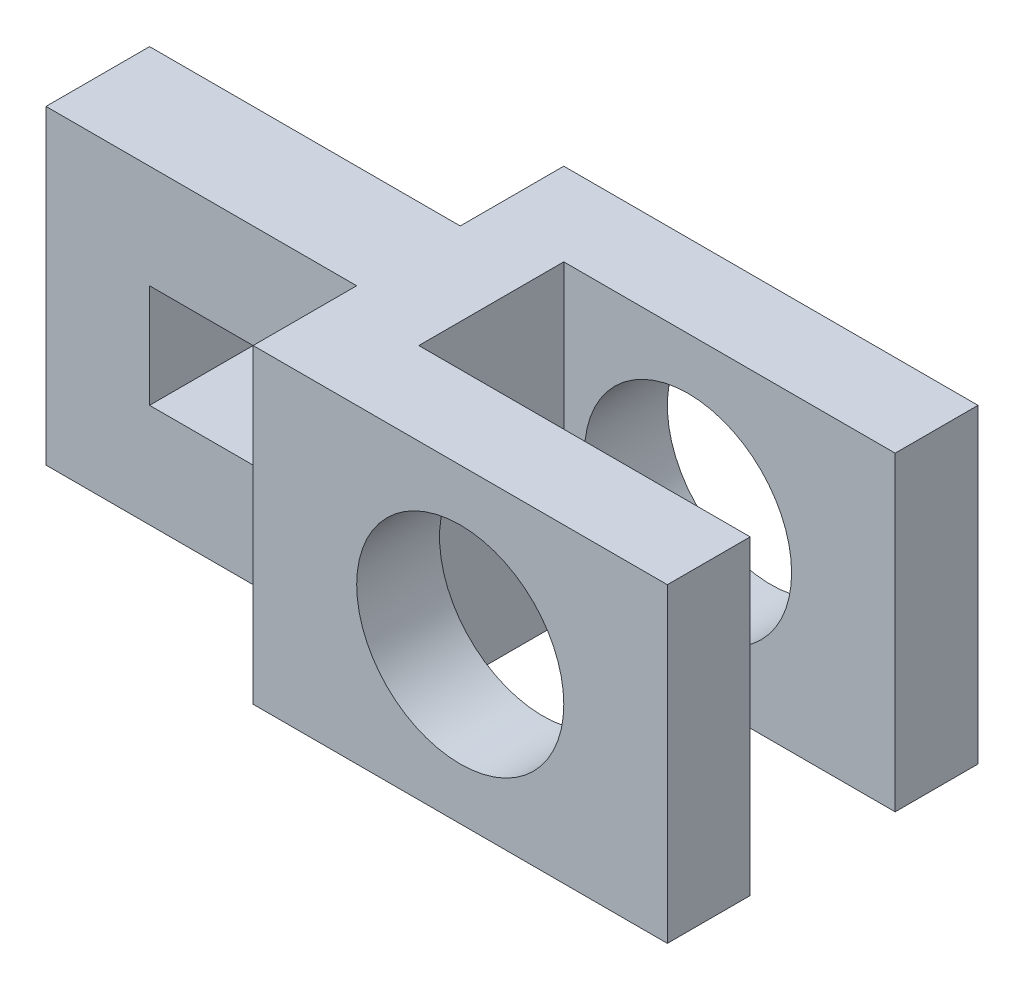
ISO-10303-21;
HEADER;
FILE_DESCRIPTION(('STEP AP214'),'2;1');
FILE_NAME('part.step','',(''),(''),'','','');
FILE_SCHEMA(('AUTOMOTIVE_DESIGN { 1 0 10303 214 1 1 1 1 }'));
ENDSEC;
DATA;
#1=APPLICATION_CONTEXT('core data for automotive mechanical design processes');
#2=APPLICATION_PROTOCOL_DEFINITION('international standard','automotive_design',2000,#1);
#3=PRODUCT_CONTEXT('',#1,'mechanical');
#4=PRODUCT('Part','Part','',(#3));
#5=PRODUCT_RELATED_PRODUCT_CATEGORY('part','',(#4));
#6=PRODUCT_DEFINITION_FORMATION('','',#4);
#7=PRODUCT_DEFINITION_CONTEXT('part definition',#1,'design');
#8=PRODUCT_DEFINITION('design','',#6,#7);
#9=PRODUCT_DEFINITION_SHAPE('','',#8);
#10=(LENGTH_UNIT() NAMED_UNIT(*) SI_UNIT(.MILLI.,.METRE.));
#11=(NAMED_UNIT(*) PLANE_ANGLE_UNIT() SI_UNIT($,.RADIAN.));
#12=(NAMED_UNIT(*) SI_UNIT($,.STERADIAN.) SOLID_ANGLE_UNIT());
#13=UNCERTAINTY_MEASURE_WITH_UNIT(LENGTH_MEASURE(1.E-05),#10,'distance_accuracy_value','');
#14=(GEOMETRIC_REPRESENTATION_CONTEXT(3) GLOBAL_UNCERTAINTY_ASSIGNED_CONTEXT((#13)) GLOBAL_UNIT_ASSIGNED_CONTEXT((#10,
#11,#12)) REPRESENTATION_CONTEXT('',''));
#15=CARTESIAN_POINT('',(0.,0.,0.));
#16=DIRECTION('',(0.,0.,1.));
#17=DIRECTION('',(1.,0.,0.));
#18=AXIS2_PLACEMENT_3D('',#15,#16,#17);
#19=CARTESIAN_POINT('',(-60.496316141996,30.,-13.866104181659));
#20=DIRECTION('',(1.,0.,0.));
#21=DIRECTION('',(0.,0.,-1.));
#22=AXIS2_PLACEMENT_3D('',#19,#20,#21);
#23=PLANE('',#22);
#24=DIRECTION('',(0.,0.,1.));
#25=VECTOR('',#24,1.);
#26=CARTESIAN_POINT('',(-60.496316141996,0.,-13.866104181659));
#27=LINE('',#26,#25);
#28=CARTESIAN_POINT('',(-60.496316141996,0.,-23.8677160080375));
#29=VERTEX_POINT('',#28);
#30=CARTESIAN_POINT('',(-60.496316141996,0.,-13.866104181659));
#31=VERTEX_POINT('',#30);
#32=EDGE_CURVE('E185',#29,#31,#27,.T.);
#33=ORIENTED_EDGE('',*,*,#32,.T.);
#34=DIRECTION('',(0.,-1.,0.));
#35=VECTOR('',#34,1.);
#36=CARTESIAN_POINT('',(-60.496316141996,30.,-13.866104181659));
#37=LINE('',#36,#35);
#38=CARTESIAN_POINT('',(-60.496316141996,30.,-13.866104181659));
#39=VERTEX_POINT('',#38);
#40=EDGE_CURVE('E268',#39,#31,#37,.T.);
#41=ORIENTED_EDGE('',*,*,#40,.F.);
#42=DIRECTION('',(0.,0.,1.));
#43=VECTOR('',#42,1.);
#44=CARTESIAN_POINT('',(-60.496316141996,30.,-13.866104181659));
#45=LINE('',#44,#43);
#46=CARTESIAN_POINT('',(-60.496316141996,30.,-23.8677160080375));
#47=VERTEX_POINT('',#46);
#48=EDGE_CURVE('E186',#47,#39,#45,.T.);
#49=ORIENTED_EDGE('',*,*,#48,.F.);
#50=DIRECTION('',(0.,-1.,0.));
#51=VECTOR('',#50,1.);
#52=CARTESIAN_POINT('',(-60.496316141996,30.,-23.8677160080375));
#53=LINE('',#52,#51);
#54=EDGE_CURVE('E212',#47,#29,#53,.T.);
#55=ORIENTED_EDGE('',*,*,#54,.T.);
#56=EDGE_LOOP('',(#33,#41,#49,#55));
#57=FACE_BOUND('',#56,.T.);
#58=ADVANCED_FACE('F33',(#57),#23,.F.);
#59=CARTESIAN_POINT('',(-30.496316141996,30.,-13.866104181659));
#60=DIRECTION('',(0.,0.,-1.));
#61=DIRECTION('',(-1.,0.,0.));
#62=AXIS2_PLACEMENT_3D('',#59,#60,#61);
#63=PLANE('',#62);
#64=DIRECTION('',(-1.,0.,0.));
#65=VECTOR('',#64,1.);
#66=CARTESIAN_POINT('',(-40.496316141996,20.,-13.866104181659));
#67=LINE('',#66,#65);
#68=CARTESIAN_POINT('',(-40.496316141996,20.,-13.866104181659));
#69=VERTEX_POINT('',#68);
#70=CARTESIAN_POINT('',(-50.496316141996,20.,-13.866104181659));
#71=VERTEX_POINT('',#70);
#72=EDGE_CURVE('E157',#69,#71,#67,.T.);
#73=ORIENTED_EDGE('',*,*,#72,.F.);
#74=DIRECTION('',(0.,1.,0.));
#75=VECTOR('',#74,1.);
#76=CARTESIAN_POINT('',(-40.496316141996,20.,-13.866104181659));
#77=LINE('',#76,#75);
#78=CARTESIAN_POINT('',(-40.496316141996,9.99999999999999,-13.866104181659));
#79=VERTEX_POINT('',#78);
#80=EDGE_CURVE('E47',#79,#69,#77,.T.);
#81=ORIENTED_EDGE('',*,*,#80,.F.);
#82=DIRECTION('',(1.,0.,0.));
#83=VECTOR('',#82,1.);
#84=CARTESIAN_POINT('',(-40.496316141996,9.99999999999999,-13.866104181659));
#85=LINE('',#84,#83);
#86=CARTESIAN_POINT('',(-50.496316141996,9.99999999999999,-13.866104181659));
#87=VERTEX_POINT('',#86);
#88=EDGE_CURVE('E164',#87,#79,#85,.T.);
#89=ORIENTED_EDGE('',*,*,#88,.F.);
#90=DIRECTION('',(0.,-1.,0.));
#91=VECTOR('',#90,1.);
#92=CARTESIAN_POINT('',(-50.496316141996,20.,-13.866104181659));
#93=LINE('',#92,#91);
#94=EDGE_CURVE('E148',#71,#87,#93,.T.);
#95=ORIENTED_EDGE('',*,*,#94,.F.);
#96=EDGE_LOOP('',(#73,#81,#89,#95));
#97=FACE_BOUND('',#96,.T.);
#98=DIRECTION('',(1.,0.,0.));
#99=VECTOR('',#98,1.);
#100=CARTESIAN_POINT('',(-30.496316141996,0.,-13.866104181659));
#101=LINE('',#100,#99);
#102=CARTESIAN_POINT('',(-30.496316141996,0.,-13.866104181659));
#103=VERTEX_POINT('',#102);
#104=EDGE_CURVE('E215',#31,#103,#101,.T.);
#105=ORIENTED_EDGE('',*,*,#104,.T.);
#106=DIRECTION('',(0.,-1.,0.));
#107=VECTOR('',#106,1.);
#108=CARTESIAN_POINT('',(-30.496316141996,30.,-13.866104181659));
#109=LINE('',#108,#107);
#110=CARTESIAN_POINT('',(-30.496316141996,30.,-13.866104181659));
#111=VERTEX_POINT('',#110);
#112=EDGE_CURVE('E265',#111,#103,#109,.T.);
#113=ORIENTED_EDGE('',*,*,#112,.F.);
#114=DIRECTION('',(1.,0.,0.));
#115=VECTOR('',#114,1.);
#116=CARTESIAN_POINT('',(-30.496316141996,30.,-13.866104181659));
#117=LINE('',#116,#115);
#118=EDGE_CURVE('E189',#39,#111,#117,.T.);
#119=ORIENTED_EDGE('',*,*,#118,.F.);
#120=ORIENTED_EDGE('',*,*,#40,.T.);
#121=EDGE_LOOP('',(#105,#113,#119,#120));
#122=FACE_BOUND('',#121,.T.);
#123=ADVANCED_FACE('F161',(#97,#122),#63,.F.);
#124=CARTESIAN_POINT('',(-30.496316141996,30.,-3.86771600803751));
#125=DIRECTION('',(1.,0.,0.));
#126=DIRECTION('',(0.,0.,-1.));
#127=AXIS2_PLACEMENT_3D('',#124,#125,#126);
#128=PLANE('',#127);
#129=DIRECTION('',(0.,0.,1.));
#130=VECTOR('',#129,1.);
#131=CARTESIAN_POINT('',(-30.496316141996,0.,-3.86771600803751));
#132=LINE('',#131,#130);
#133=CARTESIAN_POINT('',(-30.496316141996,0.,-3.86771600803751));
#134=VERTEX_POINT('',#133);
#135=EDGE_CURVE('E217',#103,#134,#132,.T.);
#136=ORIENTED_EDGE('',*,*,#135,.T.);
#137=DIRECTION('',(0.,-1.,0.));
#138=VECTOR('',#137,1.);
#139=CARTESIAN_POINT('',(-30.496316141996,30.,-3.86771600803751));
#140=LINE('',#139,#138);
#141=CARTESIAN_POINT('',(-30.496316141996,30.,-3.86771600803751));
#142=VERTEX_POINT('',#141);
#143=EDGE_CURVE('E262',#142,#134,#140,.T.);
#144=ORIENTED_EDGE('',*,*,#143,.F.);
#145=DIRECTION('',(0.,0.,1.));
#146=VECTOR('',#145,1.);
#147=CARTESIAN_POINT('',(-30.496316141996,30.,-3.86771600803751));
#148=LINE('',#147,#146);
#149=EDGE_CURVE('E192',#111,#142,#148,.T.);
#150=ORIENTED_EDGE('',*,*,#149,.F.);
#151=ORIENTED_EDGE('',*,*,#112,.T.);
#152=EDGE_LOOP('',(#136,#144,#150,#151));
#153=FACE_BOUND('',#152,.T.);
#154=ADVANCED_FACE('F298',(#153),#128,.F.);
#155=CARTESIAN_POINT('',(-30.496316141996,30.,-3.86771600803751));
#156=DIRECTION('',(0.,0.,-1.));
#157=DIRECTION('',(-1.,0.,0.));
#158=AXIS2_PLACEMENT_3D('',#155,#156,#157);
#159=PLANE('',#158);
#160=CARTESIAN_POINT('',(-10.496316141996,15.,-3.86771600803751));
#161=DIRECTION('',(0.,0.,-1.));
#162=DIRECTION('',(-1.,0.,0.));
#163=AXIS2_PLACEMENT_3D('',#160,#161,#162);
#164=CIRCLE('',#163,10.);
#165=CARTESIAN_POINT('',(-20.496316141996,15.,-3.86771600803751));
#166=VERTEX_POINT('',#165);
#167=EDGE_CURVE('E182',#166,#166,#164,.T.);
#168=ORIENTED_EDGE('',*,*,#167,.T.);
#169=EDGE_LOOP('',(#168));
#170=FACE_BOUND('',#169,.T.);
#171=DIRECTION('',(1.,0.,0.));
#172=VECTOR('',#171,1.);
#173=CARTESIAN_POINT('',(-30.496316141996,0.,-3.86771600803751));
#174=LINE('',#173,#172);
#175=CARTESIAN_POINT('',(9.50368385800401,0.,-3.86771600803751));
#176=VERTEX_POINT('',#175);
#177=EDGE_CURVE('E219',#134,#176,#174,.T.);
#178=ORIENTED_EDGE('',*,*,#177,.T.);
#179=DIRECTION('',(0.,-1.,0.));
#180=VECTOR('',#179,1.);
#181=CARTESIAN_POINT('',(9.50368385800401,30.,-3.86771600803751));
#182=LINE('',#181,#180);
#183=CARTESIAN_POINT('',(9.50368385800401,30.,-3.86771600803751));
#184=VERTEX_POINT('',#183);
#185=EDGE_CURVE('E259',#184,#176,#182,.T.);
#186=ORIENTED_EDGE('',*,*,#185,.F.);
#187=DIRECTION('',(1.,0.,0.));
#188=VECTOR('',#187,1.);
#189=CARTESIAN_POINT('',(-30.496316141996,30.,-3.86771600803751));
#190=LINE('',#189,#188);
#191=EDGE_CURVE('E194',#142,#184,#190,.T.);
#192=ORIENTED_EDGE('',*,*,#191,.F.);
#193=ORIENTED_EDGE('',*,*,#143,.T.);
#194=EDGE_LOOP('',(#178,#186,#192,#193));
#195=FACE_BOUND('',#194,.T.);
#196=ADVANCED_FACE('F350',(#170,#195),#159,.F.);
#197=CARTESIAN_POINT('',(9.50368385800401,30.,-3.86771600803751));
#198=DIRECTION('',(-1.,0.,0.));
#199=DIRECTION('',(0.,0.,1.));
#200=AXIS2_PLACEMENT_3D('',#197,#198,#199);
#201=PLANE('',#200);
#202=DIRECTION('',(0.,0.,-1.));
#203=VECTOR('',#202,1.);
#204=CARTESIAN_POINT('',(9.50368385800401,0.,-3.86771600803751));
#205=LINE('',#204,#203);
#206=CARTESIAN_POINT('',(9.50368385800401,0.,-11.8677160080375));
#207=VERTEX_POINT('',#206);
#208=EDGE_CURVE('E221',#176,#207,#205,.T.);
#209=ORIENTED_EDGE('',*,*,#208,.T.);
#210=DIRECTION('',(0.,-1.,0.));
#211=VECTOR('',#210,1.);
#212=CARTESIAN_POINT('',(9.50368385800401,30.,-11.8677160080375));
#213=LINE('',#212,#211);
#214=CARTESIAN_POINT('',(9.50368385800401,30.,-11.8677160080375));
#215=VERTEX_POINT('',#214);
#216=EDGE_CURVE('E256',#215,#207,#213,.T.);
#217=ORIENTED_EDGE('',*,*,#216,.F.);
#218=DIRECTION('',(0.,0.,-1.));
#219=VECTOR('',#218,1.);
#220=CARTESIAN_POINT('',(9.50368385800401,30.,-3.86771600803751));
#221=LINE('',#220,#219);
#222=EDGE_CURVE('E196',#184,#215,#221,.T.);
#223=ORIENTED_EDGE('',*,*,#222,.F.);
#224=ORIENTED_EDGE('',*,*,#185,.T.);
#225=EDGE_LOOP('',(#209,#217,#223,#224));
#226=FACE_BOUND('',#225,.T.);
#227=ADVANCED_FACE('F347',(#226),#201,.F.);
#228=CARTESIAN_POINT('',(9.50368385800401,30.,-11.8677160080375));
#229=DIRECTION('',(0.,0.,1.));
#230=DIRECTION('',(1.,0.,0.));
#231=AXIS2_PLACEMENT_3D('',#228,#229,#230);
#232=PLANE('',#231);
#233=CARTESIAN_POINT('',(-10.496316141996,15.,-11.8677160080375));
#234=DIRECTION('',(0.,0.,1.));
#235=DIRECTION('',(1.,0.,0.));
#236=AXIS2_PLACEMENT_3D('',#233,#234,#235);
#237=CIRCLE('',#236,10.);
#238=CARTESIAN_POINT('',(-0.49631614199599,15.,-11.8677160080375));
#239=VERTEX_POINT('',#238);
#240=EDGE_CURVE('E179',#239,#239,#237,.T.);
#241=ORIENTED_EDGE('',*,*,#240,.T.);
#242=EDGE_LOOP('',(#241));
#243=FACE_BOUND('',#242,.T.);
#244=DIRECTION('',(-1.,0.,0.));
#245=VECTOR('',#244,1.);
#246=CARTESIAN_POINT('',(9.50368385800401,0.,-11.8677160080375));
#247=LINE('',#246,#245);
#248=CARTESIAN_POINT('',(-22.496316141996,0.,-11.8677160080375));
#249=VERTEX_POINT('',#248);
#250=EDGE_CURVE('E223',#207,#249,#247,.T.);
#251=ORIENTED_EDGE('',*,*,#250,.T.);
#252=DIRECTION('',(0.,-1.,0.));
#253=VECTOR('',#252,1.);
#254=CARTESIAN_POINT('',(-22.496316141996,30.,-11.8677160080375));
#255=LINE('',#254,#253);
#256=CARTESIAN_POINT('',(-22.496316141996,30.,-11.8677160080375));
#257=VERTEX_POINT('',#256);
#258=EDGE_CURVE('E253',#257,#249,#255,.T.);
#259=ORIENTED_EDGE('',*,*,#258,.F.);
#260=DIRECTION('',(-1.,0.,0.));
#261=VECTOR('',#260,1.);
#262=CARTESIAN_POINT('',(9.50368385800401,30.,-11.8677160080375));
#263=LINE('',#262,#261);
#264=EDGE_CURVE('E198',#215,#257,#263,.T.);
#265=ORIENTED_EDGE('',*,*,#264,.F.);
#266=ORIENTED_EDGE('',*,*,#216,.T.);
#267=EDGE_LOOP('',(#251,#259,#265,#266));
#268=FACE_BOUND('',#267,.T.);
#269=ADVANCED_FACE('F343',(#243,#268),#232,.F.);
#270=CARTESIAN_POINT('',(-22.496316141996,30.,-11.8677160080375));
#271=DIRECTION('',(-1.,0.,0.));
#272=DIRECTION('',(0.,0.,1.));
#273=AXIS2_PLACEMENT_3D('',#270,#271,#272);
#274=PLANE('',#273);
#275=DIRECTION('',(0.,0.,-1.));
#276=VECTOR('',#275,1.);
#277=CARTESIAN_POINT('',(-22.496316141996,0.,-11.8677160080375));
#278=LINE('',#277,#276);
#279=CARTESIAN_POINT('',(-22.496316141996,0.,-25.8677160080375));
#280=VERTEX_POINT('',#279);
#281=EDGE_CURVE('E225',#249,#280,#278,.T.);
#282=ORIENTED_EDGE('',*,*,#281,.T.);
#283=DIRECTION('',(0.,-1.,0.));
#284=VECTOR('',#283,1.);
#285=CARTESIAN_POINT('',(-22.496316141996,30.,-25.8677160080375));
#286=LINE('',#285,#284);
#287=CARTESIAN_POINT('',(-22.496316141996,30.,-25.8677160080375));
#288=VERTEX_POINT('',#287);
#289=EDGE_CURVE('E250',#288,#280,#286,.T.);
#290=ORIENTED_EDGE('',*,*,#289,.F.);
#291=DIRECTION('',(0.,0.,-1.));
#292=VECTOR('',#291,1.);
#293=CARTESIAN_POINT('',(-22.496316141996,30.,-11.8677160080375));
#294=LINE('',#293,#292);
#295=EDGE_CURVE('E200',#257,#288,#294,.T.);
#296=ORIENTED_EDGE('',*,*,#295,.F.);
#297=ORIENTED_EDGE('',*,*,#258,.T.);
#298=EDGE_LOOP('',(#282,#290,#296,#297));
#299=FACE_BOUND('',#298,.T.);
#300=ADVANCED_FACE('F338',(#299),#274,.F.);
#301=CARTESIAN_POINT('',(-22.496316141996,30.,-25.8677160080375));
#302=DIRECTION('',(0.,0.,-1.));
#303=DIRECTION('',(-1.,0.,0.));
#304=AXIS2_PLACEMENT_3D('',#301,#302,#303);
#305=PLANE('',#304);
#306=CARTESIAN_POINT('',(-10.496316141996,15.,-25.8677160080375));
#307=DIRECTION('',(0.,0.,-1.));
#308=DIRECTION('',(-1.,0.,0.));
#309=AXIS2_PLACEMENT_3D('',#306,#307,#308);
#310=CIRCLE('',#309,10.);
#311=CARTESIAN_POINT('',(-20.496316141996,15.,-25.8677160080375));
#312=VERTEX_POINT('',#311);
#313=EDGE_CURVE('E176',#312,#312,#310,.T.);
#314=ORIENTED_EDGE('',*,*,#313,.T.);
#315=EDGE_LOOP('',(#314));
#316=FACE_BOUND('',#315,.T.);
#317=DIRECTION('',(1.,0.,0.));
#318=VECTOR('',#317,1.);
#319=CARTESIAN_POINT('',(-22.496316141996,0.,-25.8677160080375));
#320=LINE('',#319,#318);
#321=CARTESIAN_POINT('',(9.50368385800401,0.,-25.8677160080375));
#322=VERTEX_POINT('',#321);
#323=EDGE_CURVE('E227',#280,#322,#320,.T.);
#324=ORIENTED_EDGE('',*,*,#323,.T.);
#325=DIRECTION('',(0.,-1.,0.));
#326=VECTOR('',#325,1.);
#327=CARTESIAN_POINT('',(9.50368385800401,30.,-25.8677160080375));
#328=LINE('',#327,#326);
#329=CARTESIAN_POINT('',(9.50368385800401,30.,-25.8677160080375));
#330=VERTEX_POINT('',#329);
#331=EDGE_CURVE('E247',#330,#322,#328,.T.);
#332=ORIENTED_EDGE('',*,*,#331,.F.);
#333=DIRECTION('',(1.,0.,0.));
#334=VECTOR('',#333,1.);
#335=CARTESIAN_POINT('',(-22.496316141996,30.,-25.8677160080375));
#336=LINE('',#335,#334);
#337=EDGE_CURVE('E202',#288,#330,#336,.T.);
#338=ORIENTED_EDGE('',*,*,#337,.F.);
#339=ORIENTED_EDGE('',*,*,#289,.T.);
#340=EDGE_LOOP('',(#324,#332,#338,#339));
#341=FACE_BOUND('',#340,.T.);
#342=ADVANCED_FACE('F332',(#316,#341),#305,.F.);
#343=CARTESIAN_POINT('',(9.50368385800401,30.,-25.8677160080375));
#344=DIRECTION('',(-1.,0.,0.));
#345=DIRECTION('',(0.,0.,1.));
#346=AXIS2_PLACEMENT_3D('',#343,#344,#345);
#347=PLANE('',#346);
#348=DIRECTION('',(0.,0.,-1.));
#349=VECTOR('',#348,1.);
#350=CARTESIAN_POINT('',(9.50368385800401,0.,-25.8677160080375));
#351=LINE('',#350,#349);
#352=CARTESIAN_POINT('',(9.50368385800401,0.,-33.8677160080375));
#353=VERTEX_POINT('',#352);
#354=EDGE_CURVE('E229',#322,#353,#351,.T.);
#355=ORIENTED_EDGE('',*,*,#354,.T.);
#356=DIRECTION('',(0.,-1.,0.));
#357=VECTOR('',#356,1.);
#358=CARTESIAN_POINT('',(9.50368385800401,30.,-33.8677160080375));
#359=LINE('',#358,#357);
#360=CARTESIAN_POINT('',(9.50368385800401,30.,-33.8677160080375));
#361=VERTEX_POINT('',#360);
#362=EDGE_CURVE('E244',#361,#353,#359,.T.);
#363=ORIENTED_EDGE('',*,*,#362,.F.);
#364=DIRECTION('',(0.,0.,-1.));
#365=VECTOR('',#364,1.);
#366=CARTESIAN_POINT('',(9.50368385800401,30.,-25.8677160080375));
#367=LINE('',#366,#365);
#368=EDGE_CURVE('E204',#330,#361,#367,.T.);
#369=ORIENTED_EDGE('',*,*,#368,.F.);
#370=ORIENTED_EDGE('',*,*,#331,.T.);
#371=EDGE_LOOP('',(#355,#363,#369,#370));
#372=FACE_BOUND('',#371,.T.);
#373=ADVANCED_FACE('F328',(#372),#347,.F.);
#374=CARTESIAN_POINT('',(9.50368385800401,30.,-33.8677160080375));
#375=DIRECTION('',(0.,0.,1.));
#376=DIRECTION('',(1.,0.,0.));
#377=AXIS2_PLACEMENT_3D('',#374,#375,#376);
#378=PLANE('',#377);
#379=CARTESIAN_POINT('',(-10.496316141996,15.,-33.8677160080375));
#380=DIRECTION('',(0.,0.,1.));
#381=DIRECTION('',(1.,0.,0.));
#382=AXIS2_PLACEMENT_3D('',#379,#380,#381);
#383=CIRCLE('',#382,10.);
#384=CARTESIAN_POINT('',(-0.49631614199599,15.,-33.8677160080375));
#385=VERTEX_POINT('',#384);
#386=EDGE_CURVE('E171',#385,#385,#383,.T.);
#387=ORIENTED_EDGE('',*,*,#386,.T.);
#388=EDGE_LOOP('',(#387));
#389=FACE_BOUND('',#388,.T.);
#390=DIRECTION('',(-1.,0.,0.));
#391=VECTOR('',#390,1.);
#392=CARTESIAN_POINT('',(9.50368385800401,0.,-33.8677160080375));
#393=LINE('',#392,#391);
#394=CARTESIAN_POINT('',(-30.496316141996,0.,-33.8677160080375));
#395=VERTEX_POINT('',#394);
#396=EDGE_CURVE('E231',#353,#395,#393,.T.);
#397=ORIENTED_EDGE('',*,*,#396,.T.);
#398=DIRECTION('',(0.,-1.,0.));
#399=VECTOR('',#398,1.);
#400=CARTESIAN_POINT('',(-30.496316141996,30.,-33.8677160080375));
#401=LINE('',#400,#399);
#402=CARTESIAN_POINT('',(-30.496316141996,30.,-33.8677160080375));
#403=VERTEX_POINT('',#402);
#404=EDGE_CURVE('E241',#403,#395,#401,.T.);
#405=ORIENTED_EDGE('',*,*,#404,.F.);
#406=DIRECTION('',(-1.,0.,0.));
#407=VECTOR('',#406,1.);
#408=CARTESIAN_POINT('',(9.50368385800401,30.,-33.8677160080375));
#409=LINE('',#408,#407);
#410=EDGE_CURVE('E206',#361,#403,#409,.T.);
#411=ORIENTED_EDGE('',*,*,#410,.F.);
#412=ORIENTED_EDGE('',*,*,#362,.T.);
#413=EDGE_LOOP('',(#397,#405,#411,#412));
#414=FACE_BOUND('',#413,.T.);
#415=ADVANCED_FACE('F323',(#389,#414),#378,.F.);
#416=CARTESIAN_POINT('',(-30.496316141996,30.,-33.8677160080375));
#417=DIRECTION('',(1.,0.,0.));
#418=DIRECTION('',(0.,0.,-1.));
#419=AXIS2_PLACEMENT_3D('',#416,#417,#418);
#420=PLANE('',#419);
#421=DIRECTION('',(0.,0.,1.));
#422=VECTOR('',#421,1.);
#423=CARTESIAN_POINT('',(-30.496316141996,0.,-33.8677160080375));
#424=LINE('',#423,#422);
#425=CARTESIAN_POINT('',(-30.496316141996,0.,-23.8677160080375));
#426=VERTEX_POINT('',#425);
#427=EDGE_CURVE('E233',#395,#426,#424,.T.);
#428=ORIENTED_EDGE('',*,*,#427,.T.);
#429=DIRECTION('',(0.,-1.,0.));
#430=VECTOR('',#429,1.);
#431=CARTESIAN_POINT('',(-30.496316141996,30.,-23.8677160080375));
#432=LINE('',#431,#430);
#433=CARTESIAN_POINT('',(-30.496316141996,30.,-23.8677160080375));
#434=VERTEX_POINT('',#433);
#435=EDGE_CURVE('E238',#434,#426,#432,.T.);
#436=ORIENTED_EDGE('',*,*,#435,.F.);
#437=DIRECTION('',(0.,0.,1.));
#438=VECTOR('',#437,1.);
#439=CARTESIAN_POINT('',(-30.496316141996,30.,-33.8677160080375));
#440=LINE('',#439,#438);
#441=EDGE_CURVE('E208',#403,#434,#440,.T.);
#442=ORIENTED_EDGE('',*,*,#441,.F.);
#443=ORIENTED_EDGE('',*,*,#404,.T.);
#444=EDGE_LOOP('',(#428,#436,#442,#443));
#445=FACE_BOUND('',#444,.T.);
#446=ADVANCED_FACE('F317',(#445),#420,.F.);
#447=CARTESIAN_POINT('',(-60.496316141996,30.,-23.8677160080375));
#448=DIRECTION('',(0.,0.,1.));
#449=DIRECTION('',(1.,0.,0.));
#450=AXIS2_PLACEMENT_3D('',#447,#448,#449);
#451=PLANE('',#450);
#452=DIRECTION('',(1.,0.,0.));
#453=VECTOR('',#452,1.);
#454=CARTESIAN_POINT('',(-60.496316141996,9.99999999999999,-23.8677160080375));
#455=LINE('',#454,#453);
#456=CARTESIAN_POINT('',(-50.496316141996,9.99999999999999,-23.8677160080375));
#457=VERTEX_POINT('',#456);
#458=CARTESIAN_POINT('',(-40.496316141996,9.99999999999999,-23.8677160080375));
#459=VERTEX_POINT('',#458);
#460=EDGE_CURVE('E40',#457,#459,#455,.T.);
#461=ORIENTED_EDGE('',*,*,#460,.T.);
#462=DIRECTION('',(0.,1.,0.));
#463=VECTOR('',#462,1.);
#464=CARTESIAN_POINT('',(-40.496316141996,30.,-23.8677160080375));
#465=LINE('',#464,#463);
#466=CARTESIAN_POINT('',(-40.496316141996,20.,-23.8677160080375));
#467=VERTEX_POINT('',#466);
#468=EDGE_CURVE('E11',#459,#467,#465,.T.);
#469=ORIENTED_EDGE('',*,*,#468,.T.);
#470=DIRECTION('',(-1.,0.,0.));
#471=VECTOR('',#470,1.);
#472=CARTESIAN_POINT('',(-60.496316141996,20.,-23.8677160080375));
#473=LINE('',#472,#471);
#474=CARTESIAN_POINT('',(-50.496316141996,20.,-23.8677160080375));
#475=VERTEX_POINT('',#474);
#476=EDGE_CURVE('E271',#467,#475,#473,.T.);
#477=ORIENTED_EDGE('',*,*,#476,.T.);
#478=DIRECTION('',(0.,-1.,0.));
#479=VECTOR('',#478,1.);
#480=CARTESIAN_POINT('',(-50.496316141996,30.,-23.8677160080375));
#481=LINE('',#480,#479);
#482=EDGE_CURVE('E151',#475,#457,#481,.T.);
#483=ORIENTED_EDGE('',*,*,#482,.T.);
#484=EDGE_LOOP('',(#461,#469,#477,#483));
#485=FACE_BOUND('',#484,.T.);
#486=DIRECTION('',(-1.,0.,0.));
#487=VECTOR('',#486,1.);
#488=CARTESIAN_POINT('',(-60.496316141996,0.,-23.8677160080375));
#489=LINE('',#488,#487);
#490=EDGE_CURVE('E190',#426,#29,#489,.T.);
#491=ORIENTED_EDGE('',*,*,#490,.T.);
#492=ORIENTED_EDGE('',*,*,#54,.F.);
#493=DIRECTION('',(-1.,0.,0.));
#494=VECTOR('',#493,1.);
#495=CARTESIAN_POINT('',(-60.496316141996,30.,-23.8677160080375));
#496=LINE('',#495,#494);
#497=EDGE_CURVE('E210',#434,#47,#496,.T.);
#498=ORIENTED_EDGE('',*,*,#497,.F.);
#499=ORIENTED_EDGE('',*,*,#435,.T.);
#500=EDGE_LOOP('',(#491,#492,#498,#499));
#501=FACE_BOUND('',#500,.T.);
#502=ADVANCED_FACE('F275',(#485,#501),#451,.F.);
#503=CARTESIAN_POINT('',(0.,30.,0.));
#504=DIRECTION('',(0.,-1.,0.));
#505=DIRECTION('',(0.,0.,-1.));
#506=AXIS2_PLACEMENT_3D('',#503,#504,#505);
#507=PLANE('',#506);
#508=ORIENTED_EDGE('',*,*,#48,.T.);
#509=ORIENTED_EDGE('',*,*,#118,.T.);
#510=ORIENTED_EDGE('',*,*,#149,.T.);
#511=ORIENTED_EDGE('',*,*,#191,.T.);
#512=ORIENTED_EDGE('',*,*,#222,.T.);
#513=ORIENTED_EDGE('',*,*,#264,.T.);
#514=ORIENTED_EDGE('',*,*,#295,.T.);
#515=ORIENTED_EDGE('',*,*,#337,.T.);
#516=ORIENTED_EDGE('',*,*,#368,.T.);
#517=ORIENTED_EDGE('',*,*,#410,.T.);
#518=ORIENTED_EDGE('',*,*,#441,.T.);
#519=ORIENTED_EDGE('',*,*,#497,.T.);
#520=EDGE_LOOP('',(#508,#509,#510,#511,#512,#513,#514,#515,#516,#517,#518,#519));
#521=FACE_BOUND('',#520,.T.);
#522=ADVANCED_FACE('F312',(#521),#507,.F.);
#523=CARTESIAN_POINT('',(0.,0.,0.));
#524=DIRECTION('',(0.,-1.,0.));
#525=DIRECTION('',(0.,0.,-1.));
#526=AXIS2_PLACEMENT_3D('',#523,#524,#525);
#527=PLANE('',#526);
#528=ORIENTED_EDGE('',*,*,#32,.F.);
#529=ORIENTED_EDGE('',*,*,#490,.F.);
#530=ORIENTED_EDGE('',*,*,#427,.F.);
#531=ORIENTED_EDGE('',*,*,#396,.F.);
#532=ORIENTED_EDGE('',*,*,#354,.F.);
#533=ORIENTED_EDGE('',*,*,#323,.F.);
#534=ORIENTED_EDGE('',*,*,#281,.F.);
#535=ORIENTED_EDGE('',*,*,#250,.F.);
#536=ORIENTED_EDGE('',*,*,#208,.F.);
#537=ORIENTED_EDGE('',*,*,#177,.F.);
#538=ORIENTED_EDGE('',*,*,#135,.F.);
#539=ORIENTED_EDGE('',*,*,#104,.F.);
#540=EDGE_LOOP('',(#528,#529,#530,#531,#532,#533,#534,#535,#536,#537,#538,#539));
#541=FACE_BOUND('',#540,.T.);
#542=ADVANCED_FACE('F305',(#541),#527,.T.);
#543=CARTESIAN_POINT('',(-10.496316141996,15.,-33.8677160080375));
#544=DIRECTION('',(0.,0.,1.));
#545=DIRECTION('',(1.,0.,0.));
#546=AXIS2_PLACEMENT_3D('',#543,#544,#545);
#547=CYLINDRICAL_SURFACE('',#546,10.);
#548=ORIENTED_EDGE('',*,*,#386,.F.);
#549=EDGE_LOOP('',(#548));
#550=FACE_BOUND('',#549,.T.);
#551=ORIENTED_EDGE('',*,*,#313,.F.);
#552=EDGE_LOOP('',(#551));
#553=FACE_BOUND('',#552,.T.);
#554=ADVANCED_FACE('F289',(#550,#553),#547,.F.);
#555=ORIENTED_EDGE('',*,*,#240,.F.);
#556=EDGE_LOOP('',(#555));
#557=FACE_BOUND('',#556,.T.);
#558=ORIENTED_EDGE('',*,*,#167,.F.);
#559=EDGE_LOOP('',(#558));
#560=FACE_BOUND('',#559,.T.);
#561=ADVANCED_FACE('F282',(#557,#560),#547,.F.);
#562=CARTESIAN_POINT('',(-40.496316141996,20.,-33.8677160080375));
#563=DIRECTION('',(1.,0.,0.));
#564=DIRECTION('',(0.,0.,-1.));
#565=AXIS2_PLACEMENT_3D('',#562,#563,#564);
#566=PLANE('',#565);
#567=DIRECTION('',(0.,0.,1.));
#568=VECTOR('',#567,1.);
#569=CARTESIAN_POINT('',(-40.496316141996,9.99999999999999,-33.8677160080375));
#570=LINE('',#569,#568);
#571=EDGE_CURVE('E169',#459,#79,#570,.T.);
#572=ORIENTED_EDGE('',*,*,#571,.T.);
#573=ORIENTED_EDGE('',*,*,#80,.T.);
#574=DIRECTION('',(0.,0.,1.));
#575=VECTOR('',#574,1.);
#576=CARTESIAN_POINT('',(-40.496316141996,20.,-33.8677160080375));
#577=LINE('',#576,#575);
#578=EDGE_CURVE('E154',#467,#69,#577,.T.);
#579=ORIENTED_EDGE('',*,*,#578,.F.);
#580=ORIENTED_EDGE('',*,*,#468,.F.);
#581=EDGE_LOOP('',(#572,#573,#579,#580));
#582=FACE_BOUND('',#581,.T.);
#583=ADVANCED_FACE('F280',(#582),#566,.F.);
#584=CARTESIAN_POINT('',(-40.496316141996,9.99999999999999,-33.8677160080375));
#585=DIRECTION('',(0.,-1.,0.));
#586=DIRECTION('',(1.,0.,0.));
#587=AXIS2_PLACEMENT_3D('',#584,#585,#586);
#588=PLANE('',#587);
#589=DIRECTION('',(0.,0.,1.));
#590=VECTOR('',#589,1.);
#591=CARTESIAN_POINT('',(-50.496316141996,9.99999999999999,-33.8677160080375));
#592=LINE('',#591,#590);
#593=EDGE_CURVE('E153',#457,#87,#592,.T.);
#594=ORIENTED_EDGE('',*,*,#593,.T.);
#595=ORIENTED_EDGE('',*,*,#88,.T.);
#596=ORIENTED_EDGE('',*,*,#571,.F.);
#597=ORIENTED_EDGE('',*,*,#460,.F.);
#598=EDGE_LOOP('',(#594,#595,#596,#597));
#599=FACE_BOUND('',#598,.T.);
#600=ADVANCED_FACE('F279',(#599),#588,.F.);
#601=CARTESIAN_POINT('',(-50.496316141996,20.,-33.8677160080375));
#602=DIRECTION('',(-1.,0.,0.));
#603=DIRECTION('',(0.,0.,1.));
#604=AXIS2_PLACEMENT_3D('',#601,#602,#603);
#605=PLANE('',#604);
#606=DIRECTION('',(0.,0.,1.));
#607=VECTOR('',#606,1.);
#608=CARTESIAN_POINT('',(-50.496316141996,20.,-33.8677160080375));
#609=LINE('',#608,#607);
#610=EDGE_CURVE('E55',#475,#71,#609,.T.);
#611=ORIENTED_EDGE('',*,*,#610,.T.);
#612=ORIENTED_EDGE('',*,*,#94,.T.);
#613=ORIENTED_EDGE('',*,*,#593,.F.);
#614=ORIENTED_EDGE('',*,*,#482,.F.);
#615=EDGE_LOOP('',(#611,#612,#613,#614));
#616=FACE_BOUND('',#615,.T.);
#617=ADVANCED_FACE('F145',(#616),#605,.F.);
#618=CARTESIAN_POINT('',(-40.496316141996,20.,-33.8677160080375));
#619=DIRECTION('',(0.,1.,0.));
#620=DIRECTION('',(0.,0.,1.));
#621=AXIS2_PLACEMENT_3D('',#618,#619,#620);
#622=PLANE('',#621);
#623=ORIENTED_EDGE('',*,*,#578,.T.);
#624=ORIENTED_EDGE('',*,*,#72,.T.);
#625=ORIENTED_EDGE('',*,*,#610,.F.);
#626=ORIENTED_EDGE('',*,*,#476,.F.);
#627=EDGE_LOOP('',(#623,#624,#625,#626));
#628=FACE_BOUND('',#627,.T.);
#629=ADVANCED_FACE('F158',(#628),#622,.F.);
#630=CLOSED_SHELL('',(#58,#123,#154,#196,#227,#269,#300,#342,#373,#415,#446,#502,#522,#542,#554,
#561,#583,#600,#617,#629));
#631=MANIFOLD_SOLID_BREP('B2',#630);
#632=ADVANCED_BREP_SHAPE_REPRESENTATION('',(#18,#631),#14);
#633=SHAPE_DEFINITION_REPRESENTATION(#9,#632);
ENDSEC;
END-ISO-10303-21;
